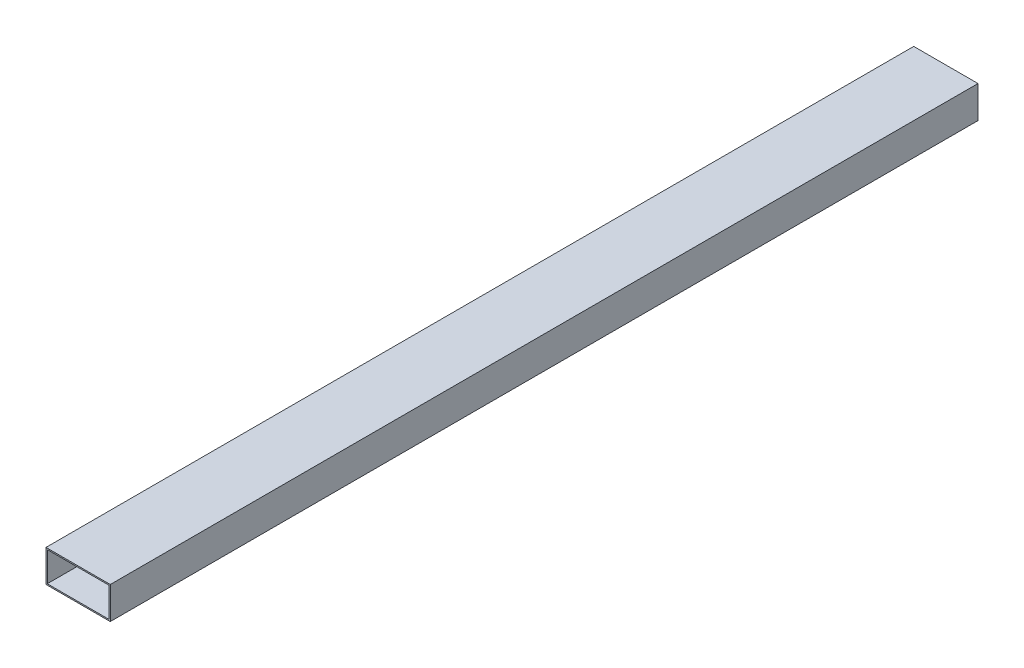
ISO-10303-21;
HEADER;
FILE_DESCRIPTION(('STEP AP214'),'2;1');
FILE_NAME('part.step','',(''),(''),'','','');
FILE_SCHEMA(('AUTOMOTIVE_DESIGN { 1 0 10303 214 1 1 1 1 }'));
ENDSEC;
DATA;
#1=APPLICATION_CONTEXT('core data for automotive mechanical design processes');
#2=APPLICATION_PROTOCOL_DEFINITION('international standard','automotive_design',2000,#1);
#3=PRODUCT_CONTEXT('',#1,'mechanical');
#4=PRODUCT('Part','Part','',(#3));
#5=PRODUCT_RELATED_PRODUCT_CATEGORY('part','',(#4));
#6=PRODUCT_DEFINITION_FORMATION('','',#4);
#7=PRODUCT_DEFINITION_CONTEXT('part definition',#1,'design');
#8=PRODUCT_DEFINITION('design','',#6,#7);
#9=PRODUCT_DEFINITION_SHAPE('','',#8);
#10=(LENGTH_UNIT() NAMED_UNIT(*) SI_UNIT(.MILLI.,.METRE.));
#11=(NAMED_UNIT(*) PLANE_ANGLE_UNIT() SI_UNIT($,.RADIAN.));
#12=(NAMED_UNIT(*) SI_UNIT($,.STERADIAN.) SOLID_ANGLE_UNIT());
#13=UNCERTAINTY_MEASURE_WITH_UNIT(LENGTH_MEASURE(1.E-05),#10,'distance_accuracy_value','');
#14=(GEOMETRIC_REPRESENTATION_CONTEXT(3) GLOBAL_UNCERTAINTY_ASSIGNED_CONTEXT((#13)) GLOBAL_UNIT_ASSIGNED_CONTEXT((#10,
#11,#12)) REPRESENTATION_CONTEXT('',''));
#15=CARTESIAN_POINT('',(0.,0.,0.));
#16=DIRECTION('',(0.,0.,1.));
#17=DIRECTION('',(1.,0.,0.));
#18=AXIS2_PLACEMENT_3D('',#15,#16,#17);
#19=CARTESIAN_POINT('',(-107.863012306017,-68.6292580101181,2700.));
#20=DIRECTION('',(0.,0.,1.));
#21=DIRECTION('',(1.,0.,0.));
#22=AXIS2_PLACEMENT_3D('',#19,#20,#21);
#23=PLANE('',#22);
#24=DIRECTION('',(0.,-1.,0.));
#25=VECTOR('',#24,1.);
#26=CARTESIAN_POINT('',(-107.863012306017,31.370741989882,2700.));
#27=LINE('',#26,#25);
#28=CARTESIAN_POINT('',(-107.863012306017,31.370741989882,2700.));
#29=VERTEX_POINT('',#28);
#30=CARTESIAN_POINT('',(-107.863012306017,-68.6292580101181,2700.));
#31=VERTEX_POINT('',#30);
#32=EDGE_CURVE('E132',#29,#31,#27,.T.);
#33=ORIENTED_EDGE('',*,*,#32,.T.);
#34=DIRECTION('',(1.,0.,0.));
#35=VECTOR('',#34,1.);
#36=CARTESIAN_POINT('',(-107.863012306017,-68.6292580101181,2700.));
#37=LINE('',#36,#35);
#38=CARTESIAN_POINT('',(92.1369876939825,-68.6292580101181,2700.));
#39=VERTEX_POINT('',#38);
#40=EDGE_CURVE('E135',#31,#39,#37,.T.);
#41=ORIENTED_EDGE('',*,*,#40,.T.);
#42=DIRECTION('',(0.,1.,0.));
#43=VECTOR('',#42,1.);
#44=CARTESIAN_POINT('',(92.1369876939825,31.370741989882,2700.));
#45=LINE('',#44,#43);
#46=CARTESIAN_POINT('',(92.1369876939825,31.370741989882,2700.));
#47=VERTEX_POINT('',#46);
#48=EDGE_CURVE('E138',#39,#47,#45,.T.);
#49=ORIENTED_EDGE('',*,*,#48,.T.);
#50=DIRECTION('',(-1.,0.,0.));
#51=VECTOR('',#50,1.);
#52=CARTESIAN_POINT('',(-107.863012306017,31.370741989882,2700.));
#53=LINE('',#52,#51);
#54=EDGE_CURVE('E140',#47,#29,#53,.T.);
#55=ORIENTED_EDGE('',*,*,#54,.T.);
#56=EDGE_LOOP('',(#33,#41,#49,#55));
#57=FACE_BOUND('',#56,.T.);
#58=DIRECTION('',(1.,0.,0.));
#59=VECTOR('',#58,1.);
#60=CARTESIAN_POINT('',(-103.863012306017,-64.629258010118,2700.));
#61=LINE('',#60,#59);
#62=CARTESIAN_POINT('',(-103.863012306017,-64.629258010118,2700.));
#63=VERTEX_POINT('',#62);
#64=CARTESIAN_POINT('',(88.1369876939825,-64.629258010118,2700.));
#65=VERTEX_POINT('',#64);
#66=EDGE_CURVE('E104',#63,#65,#61,.T.);
#67=ORIENTED_EDGE('',*,*,#66,.F.);
#68=DIRECTION('',(0.,-1.,0.));
#69=VECTOR('',#68,1.);
#70=CARTESIAN_POINT('',(-103.863012306017,27.370741989882,2700.));
#71=LINE('',#70,#69);
#72=CARTESIAN_POINT('',(-103.863012306017,27.370741989882,2700.));
#73=VERTEX_POINT('',#72);
#74=EDGE_CURVE('E96',#73,#63,#71,.T.);
#75=ORIENTED_EDGE('',*,*,#74,.F.);
#76=DIRECTION('',(-1.,0.,0.));
#77=VECTOR('',#76,1.);
#78=CARTESIAN_POINT('',(-103.863012306017,27.370741989882,2700.));
#79=LINE('',#78,#77);
#80=CARTESIAN_POINT('',(88.1369876939825,27.370741989882,2700.));
#81=VERTEX_POINT('',#80);
#82=EDGE_CURVE('E118',#81,#73,#79,.T.);
#83=ORIENTED_EDGE('',*,*,#82,.F.);
#84=DIRECTION('',(0.,1.,0.));
#85=VECTOR('',#84,1.);
#86=CARTESIAN_POINT('',(88.1369876939825,27.370741989882,2700.));
#87=LINE('',#86,#85);
#88=EDGE_CURVE('E116',#65,#81,#87,.T.);
#89=ORIENTED_EDGE('',*,*,#88,.F.);
#90=EDGE_LOOP('',(#67,#75,#83,#89));
#91=FACE_BOUND('',#90,.T.);
#92=ADVANCED_FACE('F31',(#57,#91),#23,.T.);
#93=CARTESIAN_POINT('',(-107.863012306017,-68.6292580101181,0.));
#94=DIRECTION('',(0.,0.,1.));
#95=DIRECTION('',(1.,0.,0.));
#96=AXIS2_PLACEMENT_3D('',#93,#94,#95);
#97=PLANE('',#96);
#98=DIRECTION('',(0.,-1.,0.));
#99=VECTOR('',#98,1.);
#100=CARTESIAN_POINT('',(-107.863012306017,31.370741989882,0.));
#101=LINE('',#100,#99);
#102=CARTESIAN_POINT('',(-107.863012306017,31.370741989882,0.));
#103=VERTEX_POINT('',#102);
#104=CARTESIAN_POINT('',(-107.863012306017,-68.6292580101181,0.));
#105=VERTEX_POINT('',#104);
#106=EDGE_CURVE('E112',#103,#105,#101,.T.);
#107=ORIENTED_EDGE('',*,*,#106,.F.);
#108=DIRECTION('',(-1.,0.,0.));
#109=VECTOR('',#108,1.);
#110=CARTESIAN_POINT('',(-107.863012306017,31.370741989882,0.));
#111=LINE('',#110,#109);
#112=CARTESIAN_POINT('',(92.1369876939825,31.370741989882,0.));
#113=VERTEX_POINT('',#112);
#114=EDGE_CURVE('E136',#113,#103,#111,.T.);
#115=ORIENTED_EDGE('',*,*,#114,.F.);
#116=DIRECTION('',(0.,1.,0.));
#117=VECTOR('',#116,1.);
#118=CARTESIAN_POINT('',(92.1369876939825,31.370741989882,0.));
#119=LINE('',#118,#117);
#120=CARTESIAN_POINT('',(92.1369876939825,-68.6292580101181,0.));
#121=VERTEX_POINT('',#120);
#122=EDGE_CURVE('E147',#121,#113,#119,.T.);
#123=ORIENTED_EDGE('',*,*,#122,.F.);
#124=DIRECTION('',(1.,0.,0.));
#125=VECTOR('',#124,1.);
#126=CARTESIAN_POINT('',(-107.863012306017,-68.6292580101181,0.));
#127=LINE('',#126,#125);
#128=EDGE_CURVE('E145',#105,#121,#127,.T.);
#129=ORIENTED_EDGE('',*,*,#128,.F.);
#130=EDGE_LOOP('',(#107,#115,#123,#129));
#131=FACE_BOUND('',#130,.T.);
#132=DIRECTION('',(0.,-1.,0.));
#133=VECTOR('',#132,1.);
#134=CARTESIAN_POINT('',(-103.863012306017,27.370741989882,0.));
#135=LINE('',#134,#133);
#136=CARTESIAN_POINT('',(-103.863012306017,27.370741989882,0.));
#137=VERTEX_POINT('',#136);
#138=CARTESIAN_POINT('',(-103.863012306017,-64.629258010118,0.));
#139=VERTEX_POINT('',#138);
#140=EDGE_CURVE('E54',#137,#139,#135,.T.);
#141=ORIENTED_EDGE('',*,*,#140,.T.);
#142=DIRECTION('',(1.,0.,0.));
#143=VECTOR('',#142,1.);
#144=CARTESIAN_POINT('',(-103.863012306017,-64.629258010118,0.));
#145=LINE('',#144,#143);
#146=CARTESIAN_POINT('',(88.1369876939825,-64.629258010118,0.));
#147=VERTEX_POINT('',#146);
#148=EDGE_CURVE('E111',#139,#147,#145,.T.);
#149=ORIENTED_EDGE('',*,*,#148,.T.);
#150=DIRECTION('',(0.,1.,0.));
#151=VECTOR('',#150,1.);
#152=CARTESIAN_POINT('',(88.1369876939825,27.370741989882,0.));
#153=LINE('',#152,#151);
#154=CARTESIAN_POINT('',(88.1369876939825,27.370741989882,0.));
#155=VERTEX_POINT('',#154);
#156=EDGE_CURVE('E124',#147,#155,#153,.T.);
#157=ORIENTED_EDGE('',*,*,#156,.T.);
#158=DIRECTION('',(-1.,0.,0.));
#159=VECTOR('',#158,1.);
#160=CARTESIAN_POINT('',(-103.863012306017,27.370741989882,0.));
#161=LINE('',#160,#159);
#162=EDGE_CURVE('E105',#155,#137,#161,.T.);
#163=ORIENTED_EDGE('',*,*,#162,.T.);
#164=EDGE_LOOP('',(#141,#149,#157,#163));
#165=FACE_BOUND('',#164,.T.);
#166=ADVANCED_FACE('F165',(#131,#165),#97,.F.);
#167=CARTESIAN_POINT('',(-107.863012306017,31.370741989882,2700.));
#168=DIRECTION('',(1.,0.,0.));
#169=DIRECTION('',(0.,1.,0.));
#170=AXIS2_PLACEMENT_3D('',#167,#168,#169);
#171=PLANE('',#170);
#172=ORIENTED_EDGE('',*,*,#106,.T.);
#173=DIRECTION('',(0.,0.,-1.));
#174=VECTOR('',#173,1.);
#175=CARTESIAN_POINT('',(-107.863012306017,-68.6292580101181,2700.));
#176=LINE('',#175,#174);
#177=EDGE_CURVE('E11',#31,#105,#176,.T.);
#178=ORIENTED_EDGE('',*,*,#177,.F.);
#179=ORIENTED_EDGE('',*,*,#32,.F.);
#180=DIRECTION('',(0.,0.,-1.));
#181=VECTOR('',#180,1.);
#182=CARTESIAN_POINT('',(-107.863012306017,31.370741989882,2700.));
#183=LINE('',#182,#181);
#184=EDGE_CURVE('E142',#29,#103,#183,.T.);
#185=ORIENTED_EDGE('',*,*,#184,.T.);
#186=EDGE_LOOP('',(#172,#178,#179,#185));
#187=FACE_BOUND('',#186,.T.);
#188=ADVANCED_FACE('F33',(#187),#171,.F.);
#189=CARTESIAN_POINT('',(-107.863012306017,-68.6292580101181,2700.));
#190=DIRECTION('',(0.,1.,0.));
#191=DIRECTION('',(0.,0.,1.));
#192=AXIS2_PLACEMENT_3D('',#189,#190,#191);
#193=PLANE('',#192);
#194=ORIENTED_EDGE('',*,*,#128,.T.);
#195=DIRECTION('',(0.,0.,-1.));
#196=VECTOR('',#195,1.);
#197=CARTESIAN_POINT('',(92.1369876939825,-68.6292580101181,2700.));
#198=LINE('',#197,#196);
#199=EDGE_CURVE('E39',#39,#121,#198,.T.);
#200=ORIENTED_EDGE('',*,*,#199,.F.);
#201=ORIENTED_EDGE('',*,*,#40,.F.);
#202=ORIENTED_EDGE('',*,*,#177,.T.);
#203=EDGE_LOOP('',(#194,#200,#201,#202));
#204=FACE_BOUND('',#203,.T.);
#205=ADVANCED_FACE('F175',(#204),#193,.F.);
#206=CARTESIAN_POINT('',(92.1369876939825,31.370741989882,2700.));
#207=DIRECTION('',(-1.,0.,0.));
#208=DIRECTION('',(0.,-1.,0.));
#209=AXIS2_PLACEMENT_3D('',#206,#207,#208);
#210=PLANE('',#209);
#211=ORIENTED_EDGE('',*,*,#122,.T.);
#212=DIRECTION('',(0.,0.,-1.));
#213=VECTOR('',#212,1.);
#214=CARTESIAN_POINT('',(92.1369876939825,31.370741989882,2700.));
#215=LINE('',#214,#213);
#216=EDGE_CURVE('E152',#47,#113,#215,.T.);
#217=ORIENTED_EDGE('',*,*,#216,.F.);
#218=ORIENTED_EDGE('',*,*,#48,.F.);
#219=ORIENTED_EDGE('',*,*,#199,.T.);
#220=EDGE_LOOP('',(#211,#217,#218,#219));
#221=FACE_BOUND('',#220,.T.);
#222=ADVANCED_FACE('F159',(#221),#210,.F.);
#223=CARTESIAN_POINT('',(-107.863012306017,31.370741989882,2700.));
#224=DIRECTION('',(0.,-1.,0.));
#225=DIRECTION('',(1.,0.,0.));
#226=AXIS2_PLACEMENT_3D('',#223,#224,#225);
#227=PLANE('',#226);
#228=ORIENTED_EDGE('',*,*,#114,.T.);
#229=ORIENTED_EDGE('',*,*,#184,.F.);
#230=ORIENTED_EDGE('',*,*,#54,.F.);
#231=ORIENTED_EDGE('',*,*,#216,.T.);
#232=EDGE_LOOP('',(#228,#229,#230,#231));
#233=FACE_BOUND('',#232,.T.);
#234=ADVANCED_FACE('F169',(#233),#227,.F.);
#235=CARTESIAN_POINT('',(-103.863012306017,27.370741989882,2700.));
#236=DIRECTION('',(1.,0.,0.));
#237=DIRECTION('',(0.,1.,0.));
#238=AXIS2_PLACEMENT_3D('',#235,#236,#237);
#239=PLANE('',#238);
#240=ORIENTED_EDGE('',*,*,#140,.F.);
#241=DIRECTION('',(0.,0.,-1.));
#242=VECTOR('',#241,1.);
#243=CARTESIAN_POINT('',(-103.863012306017,27.370741989882,2700.));
#244=LINE('',#243,#242);
#245=EDGE_CURVE('E100',#73,#137,#244,.T.);
#246=ORIENTED_EDGE('',*,*,#245,.F.);
#247=ORIENTED_EDGE('',*,*,#74,.T.);
#248=DIRECTION('',(0.,0.,-1.));
#249=VECTOR('',#248,1.);
#250=CARTESIAN_POINT('',(-103.863012306017,-64.629258010118,2700.));
#251=LINE('',#250,#249);
#252=EDGE_CURVE('E99',#63,#139,#251,.T.);
#253=ORIENTED_EDGE('',*,*,#252,.T.);
#254=EDGE_LOOP('',(#240,#246,#247,#253));
#255=FACE_BOUND('',#254,.T.);
#256=ADVANCED_FACE('F98',(#255),#239,.T.);
#257=CARTESIAN_POINT('',(-103.863012306017,-64.629258010118,2700.));
#258=DIRECTION('',(0.,1.,0.));
#259=DIRECTION('',(0.,0.,1.));
#260=AXIS2_PLACEMENT_3D('',#257,#258,#259);
#261=PLANE('',#260);
#262=ORIENTED_EDGE('',*,*,#148,.F.);
#263=ORIENTED_EDGE('',*,*,#252,.F.);
#264=ORIENTED_EDGE('',*,*,#66,.T.);
#265=DIRECTION('',(0.,0.,-1.));
#266=VECTOR('',#265,1.);
#267=CARTESIAN_POINT('',(88.1369876939825,-64.629258010118,2700.));
#268=LINE('',#267,#266);
#269=EDGE_CURVE('E113',#65,#147,#268,.T.);
#270=ORIENTED_EDGE('',*,*,#269,.T.);
#271=EDGE_LOOP('',(#262,#263,#264,#270));
#272=FACE_BOUND('',#271,.T.);
#273=ADVANCED_FACE('F108',(#272),#261,.T.);
#274=CARTESIAN_POINT('',(88.1369876939825,27.370741989882,2700.));
#275=DIRECTION('',(-1.,0.,0.));
#276=DIRECTION('',(0.,-1.,0.));
#277=AXIS2_PLACEMENT_3D('',#274,#275,#276);
#278=PLANE('',#277);
#279=ORIENTED_EDGE('',*,*,#156,.F.);
#280=ORIENTED_EDGE('',*,*,#269,.F.);
#281=ORIENTED_EDGE('',*,*,#88,.T.);
#282=DIRECTION('',(0.,0.,-1.));
#283=VECTOR('',#282,1.);
#284=CARTESIAN_POINT('',(88.1369876939825,27.370741989882,2700.));
#285=LINE('',#284,#283);
#286=EDGE_CURVE('E46',#81,#155,#285,.T.);
#287=ORIENTED_EDGE('',*,*,#286,.T.);
#288=EDGE_LOOP('',(#279,#280,#281,#287));
#289=FACE_BOUND('',#288,.T.);
#290=ADVANCED_FACE('F198',(#289),#278,.T.);
#291=CARTESIAN_POINT('',(-103.863012306017,27.370741989882,2700.));
#292=DIRECTION('',(0.,-1.,0.));
#293=DIRECTION('',(0.,0.,-1.));
#294=AXIS2_PLACEMENT_3D('',#291,#292,#293);
#295=PLANE('',#294);
#296=ORIENTED_EDGE('',*,*,#162,.F.);
#297=ORIENTED_EDGE('',*,*,#286,.F.);
#298=ORIENTED_EDGE('',*,*,#82,.T.);
#299=ORIENTED_EDGE('',*,*,#245,.T.);
#300=EDGE_LOOP('',(#296,#297,#298,#299));
#301=FACE_BOUND('',#300,.T.);
#302=ADVANCED_FACE('F202',(#301),#295,.T.);
#303=CLOSED_SHELL('',(#92,#166,#188,#205,#222,#234,#256,#273,#290,#302));
#304=MANIFOLD_SOLID_BREP('B2',#303);
#305=ADVANCED_BREP_SHAPE_REPRESENTATION('',(#18,#304),#14);
#306=SHAPE_DEFINITION_REPRESENTATION(#9,#305);
ENDSEC;
END-ISO-10303-21;
